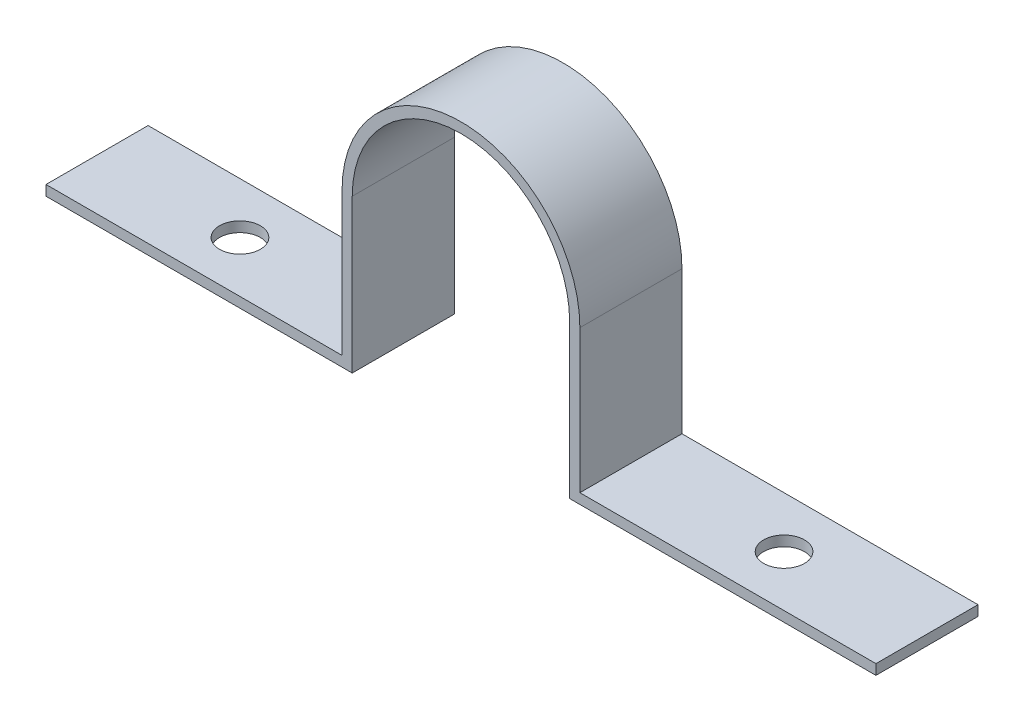
ISO-10303-21;
HEADER;
FILE_DESCRIPTION(('STEP AP214'),'2;1');
FILE_NAME('part.step','',(''),(''),'','','');
FILE_SCHEMA(('AUTOMOTIVE_DESIGN { 1 0 10303 214 1 1 1 1 }'));
ENDSEC;
DATA;
#1=APPLICATION_CONTEXT('core data for automotive mechanical design processes');
#2=APPLICATION_PROTOCOL_DEFINITION('international standard','automotive_design',2000,#1);
#3=PRODUCT_CONTEXT('',#1,'mechanical');
#4=PRODUCT('Part','Part','',(#3));
#5=PRODUCT_RELATED_PRODUCT_CATEGORY('part','',(#4));
#6=PRODUCT_DEFINITION_FORMATION('','',#4);
#7=PRODUCT_DEFINITION_CONTEXT('part definition',#1,'design');
#8=PRODUCT_DEFINITION('design','',#6,#7);
#9=PRODUCT_DEFINITION_SHAPE('','',#8);
#10=(LENGTH_UNIT() NAMED_UNIT(*) SI_UNIT(.MILLI.,.METRE.));
#11=(NAMED_UNIT(*) PLANE_ANGLE_UNIT() SI_UNIT($,.RADIAN.));
#12=(NAMED_UNIT(*) SI_UNIT($,.STERADIAN.) SOLID_ANGLE_UNIT());
#13=UNCERTAINTY_MEASURE_WITH_UNIT(LENGTH_MEASURE(1.E-05),#10,'distance_accuracy_value','');
#14=(GEOMETRIC_REPRESENTATION_CONTEXT(3) GLOBAL_UNCERTAINTY_ASSIGNED_CONTEXT((#13)) GLOBAL_UNIT_ASSIGNED_CONTEXT((#10,
#11,#12)) REPRESENTATION_CONTEXT('',''));
#15=CARTESIAN_POINT('',(0.,0.,0.));
#16=DIRECTION('',(0.,0.,1.));
#17=DIRECTION('',(1.,0.,0.));
#18=AXIS2_PLACEMENT_3D('',#15,#16,#17);
#19=CARTESIAN_POINT('',(0.,0.,10.));
#20=DIRECTION('',(0.,0.,-1.));
#21=DIRECTION('',(-1.,0.,0.));
#22=AXIS2_PLACEMENT_3D('',#19,#20,#21);
#23=CYLINDRICAL_SURFACE('',#22,10.65);
#24=CARTESIAN_POINT('',(0.,0.,0.));
#25=DIRECTION('',(0.,0.,-1.));
#26=DIRECTION('',(1.,0.,0.));
#27=AXIS2_PLACEMENT_3D('',#24,#25,#26);
#28=CIRCLE('',#27,10.65);
#29=CARTESIAN_POINT('',(-10.65,0.,0.));
#30=VERTEX_POINT('',#29);
#31=CARTESIAN_POINT('',(10.6499999999996,0.,0.));
#32=VERTEX_POINT('',#31);
#33=EDGE_CURVE('E169',#30,#32,#28,.T.);
#34=ORIENTED_EDGE('',*,*,#33,.T.);
#35=DIRECTION('',(0.,0.,-1.));
#36=VECTOR('',#35,1.);
#37=CARTESIAN_POINT('',(10.6499999999995,0.,10.));
#38=LINE('',#37,#36);
#39=CARTESIAN_POINT('',(10.6499999999995,0.,10.));
#40=VERTEX_POINT('',#39);
#41=EDGE_CURVE('E13',#40,#32,#38,.T.);
#42=ORIENTED_EDGE('',*,*,#41,.F.);
#43=CARTESIAN_POINT('',(0.,0.,10.));
#44=DIRECTION('',(0.,0.,-1.));
#45=DIRECTION('',(1.,0.,0.));
#46=AXIS2_PLACEMENT_3D('',#43,#44,#45);
#47=CIRCLE('',#46,10.65);
#48=CARTESIAN_POINT('',(-10.6500000000004,0.,10.));
#49=VERTEX_POINT('',#48);
#50=EDGE_CURVE('E194',#49,#40,#47,.T.);
#51=ORIENTED_EDGE('',*,*,#50,.F.);
#52=DIRECTION('',(0.,0.,-1.));
#53=VECTOR('',#52,1.);
#54=CARTESIAN_POINT('',(-10.6500000000004,0.,10.));
#55=LINE('',#54,#53);
#56=EDGE_CURVE('E165',#49,#30,#55,.T.);
#57=ORIENTED_EDGE('',*,*,#56,.T.);
#58=EDGE_LOOP('',(#34,#42,#51,#57));
#59=FACE_BOUND('',#58,.T.);
#60=ADVANCED_FACE('F47',(#59),#23,.F.);
#61=CARTESIAN_POINT('',(10.6499999999995,0.,10.));
#62=DIRECTION('',(1.,0.,0.));
#63=DIRECTION('',(0.,1.,0.));
#64=AXIS2_PLACEMENT_3D('',#61,#62,#63);
#65=PLANE('',#64);
#66=DIRECTION('',(0.,-1.,0.));
#67=VECTOR('',#66,1.);
#68=CARTESIAN_POINT('',(10.6499999999996,0.,0.));
#69=LINE('',#68,#67);
#70=CARTESIAN_POINT('',(10.6499999999995,-15.0000000000001,4.44089209850063E-13));
#71=VERTEX_POINT('',#70);
#72=EDGE_CURVE('E172',#32,#71,#69,.T.);
#73=ORIENTED_EDGE('',*,*,#72,.T.);
#74=DIRECTION('',(0.,0.,-1.));
#75=VECTOR('',#74,1.);
#76=CARTESIAN_POINT('',(10.6499999999995,-15.0000000000001,10.0000000000004));
#77=LINE('',#76,#75);
#78=CARTESIAN_POINT('',(10.6499999999995,-15.0000000000001,10.0000000000004));
#79=VERTEX_POINT('',#78);
#80=EDGE_CURVE('E56',#79,#71,#77,.T.);
#81=ORIENTED_EDGE('',*,*,#80,.F.);
#82=DIRECTION('',(0.,-1.,0.));
#83=VECTOR('',#82,1.);
#84=CARTESIAN_POINT('',(10.6499999999995,0.,10.));
#85=LINE('',#84,#83);
#86=EDGE_CURVE('E120',#40,#79,#85,.T.);
#87=ORIENTED_EDGE('',*,*,#86,.F.);
#88=ORIENTED_EDGE('',*,*,#41,.T.);
#89=EDGE_LOOP('',(#73,#81,#87,#88));
#90=FACE_BOUND('',#89,.T.);
#91=ADVANCED_FACE('F271',(#90),#65,.F.);
#92=CARTESIAN_POINT('',(10.6499999999995,-15.0000000000001,10.0000000000004));
#93=DIRECTION('',(0.,1.,0.));
#94=DIRECTION('',(-1.,0.,0.));
#95=AXIS2_PLACEMENT_3D('',#92,#93,#94);
#96=PLANE('',#95);
#97=CARTESIAN_POINT('',(26.65,-15.0000000000001,5.));
#98=DIRECTION('',(0.,1.,0.));
#99=DIRECTION('',(-1.,0.,0.));
#100=AXIS2_PLACEMENT_3D('',#97,#98,#99);
#101=CIRCLE('',#100,2.);
#102=CARTESIAN_POINT('',(24.6499999999999,-15.0000000000001,5.));
#103=VERTEX_POINT('',#102);
#104=EDGE_CURVE('E173',#103,#103,#101,.F.);
#105=ORIENTED_EDGE('',*,*,#104,.F.);
#106=EDGE_LOOP('',(#105));
#107=FACE_BOUND('',#106,.T.);
#108=DIRECTION('',(1.,0.,0.));
#109=VECTOR('',#108,1.);
#110=CARTESIAN_POINT('',(10.6499999999995,-15.0000000000001,4.44089209850063E-13));
#111=LINE('',#110,#109);
#112=CARTESIAN_POINT('',(40.6500000000001,-15.0000000000001,0.));
#113=VERTEX_POINT('',#112);
#114=EDGE_CURVE('E175',#71,#113,#111,.T.);
#115=ORIENTED_EDGE('',*,*,#114,.T.);
#116=DIRECTION('',(0.,0.,-1.));
#117=VECTOR('',#116,1.);
#118=CARTESIAN_POINT('',(40.65,-15.0000000000001,10.));
#119=LINE('',#118,#117);
#120=CARTESIAN_POINT('',(40.65,-15.0000000000001,10.));
#121=VERTEX_POINT('',#120);
#122=EDGE_CURVE('E213',#121,#113,#119,.T.);
#123=ORIENTED_EDGE('',*,*,#122,.F.);
#124=DIRECTION('',(1.,0.,0.));
#125=VECTOR('',#124,1.);
#126=CARTESIAN_POINT('',(10.6499999999995,-15.0000000000001,10.0000000000004));
#127=LINE('',#126,#125);
#128=EDGE_CURVE('E232',#79,#121,#127,.T.);
#129=ORIENTED_EDGE('',*,*,#128,.F.);
#130=ORIENTED_EDGE('',*,*,#80,.T.);
#131=EDGE_LOOP('',(#115,#123,#129,#130));
#132=FACE_BOUND('',#131,.T.);
#133=ADVANCED_FACE('F275',(#107,#132),#96,.F.);
#134=CARTESIAN_POINT('',(40.65,-15.0000000000001,10.));
#135=DIRECTION('',(-1.,0.,0.));
#136=DIRECTION('',(0.,0.,1.));
#137=AXIS2_PLACEMENT_3D('',#134,#135,#136);
#138=PLANE('',#137);
#139=DIRECTION('',(0.,1.,0.));
#140=VECTOR('',#139,1.);
#141=CARTESIAN_POINT('',(40.6500000000001,-15.0000000000001,0.));
#142=LINE('',#141,#140);
#143=CARTESIAN_POINT('',(40.65,-14.,0.));
#144=VERTEX_POINT('',#143);
#145=EDGE_CURVE('E177',#113,#144,#142,.T.);
#146=ORIENTED_EDGE('',*,*,#145,.T.);
#147=DIRECTION('',(0.,0.,-1.));
#148=VECTOR('',#147,1.);
#149=CARTESIAN_POINT('',(40.65,-14.,10.));
#150=LINE('',#149,#148);
#151=CARTESIAN_POINT('',(40.65,-14.,10.));
#152=VERTEX_POINT('',#151);
#153=EDGE_CURVE('E210',#152,#144,#150,.T.);
#154=ORIENTED_EDGE('',*,*,#153,.F.);
#155=DIRECTION('',(0.,1.,0.));
#156=VECTOR('',#155,1.);
#157=CARTESIAN_POINT('',(40.65,-15.0000000000001,10.));
#158=LINE('',#157,#156);
#159=EDGE_CURVE('E234',#121,#152,#158,.T.);
#160=ORIENTED_EDGE('',*,*,#159,.F.);
#161=ORIENTED_EDGE('',*,*,#122,.T.);
#162=EDGE_LOOP('',(#146,#154,#160,#161));
#163=FACE_BOUND('',#162,.T.);
#164=ADVANCED_FACE('F279',(#163),#138,.F.);
#165=CARTESIAN_POINT('',(11.6499999999999,-14.0000000000001,10.0000000000004));
#166=DIRECTION('',(0.,-1.,0.));
#167=DIRECTION('',(1.,0.,0.));
#168=AXIS2_PLACEMENT_3D('',#165,#166,#167);
#169=PLANE('',#168);
#170=CARTESIAN_POINT('',(26.65,-14.,5.));
#171=DIRECTION('',(0.,-1.,0.));
#172=DIRECTION('',(1.,0.,0.));
#173=AXIS2_PLACEMENT_3D('',#170,#171,#172);
#174=CIRCLE('',#173,2.);
#175=CARTESIAN_POINT('',(28.65,-14.,5.));
#176=VERTEX_POINT('',#175);
#177=EDGE_CURVE('E50',#176,#176,#174,.F.);
#178=ORIENTED_EDGE('',*,*,#177,.F.);
#179=EDGE_LOOP('',(#178));
#180=FACE_BOUND('',#179,.T.);
#181=DIRECTION('',(-1.,0.,0.));
#182=VECTOR('',#181,1.);
#183=CARTESIAN_POINT('',(11.65,-14.0000000000001,4.44089209850063E-13));
#184=LINE('',#183,#182);
#185=CARTESIAN_POINT('',(11.65,-14.0000000000001,4.44089209850063E-13));
#186=VERTEX_POINT('',#185);
#187=EDGE_CURVE('E180',#144,#186,#184,.T.);
#188=ORIENTED_EDGE('',*,*,#187,.T.);
#189=DIRECTION('',(0.,0.,-1.));
#190=VECTOR('',#189,1.);
#191=CARTESIAN_POINT('',(11.6499999999999,-14.0000000000001,10.0000000000004));
#192=LINE('',#191,#190);
#193=CARTESIAN_POINT('',(11.6499999999999,-14.0000000000001,10.0000000000004));
#194=VERTEX_POINT('',#193);
#195=EDGE_CURVE('E207',#194,#186,#192,.T.);
#196=ORIENTED_EDGE('',*,*,#195,.F.);
#197=DIRECTION('',(-1.,0.,0.));
#198=VECTOR('',#197,1.);
#199=CARTESIAN_POINT('',(39.65,-14.,10.));
#200=LINE('',#199,#198);
#201=EDGE_CURVE('E236',#152,#194,#200,.T.);
#202=ORIENTED_EDGE('',*,*,#201,.F.);
#203=ORIENTED_EDGE('',*,*,#153,.T.);
#204=EDGE_LOOP('',(#188,#196,#202,#203));
#205=FACE_BOUND('',#204,.T.);
#206=ADVANCED_FACE('F285',(#180,#205),#169,.F.);
#207=CARTESIAN_POINT('',(11.6499999999996,0.,10.));
#208=DIRECTION('',(-1.,0.,0.));
#209=DIRECTION('',(0.,0.,1.));
#210=AXIS2_PLACEMENT_3D('',#207,#208,#209);
#211=PLANE('',#210);
#212=DIRECTION('',(0.,1.,0.));
#213=VECTOR('',#212,1.);
#214=CARTESIAN_POINT('',(11.65,0.,0.));
#215=LINE('',#214,#213);
#216=CARTESIAN_POINT('',(11.65,0.,0.));
#217=VERTEX_POINT('',#216);
#218=EDGE_CURVE('E182',#186,#217,#215,.T.);
#219=ORIENTED_EDGE('',*,*,#218,.T.);
#220=DIRECTION('',(0.,0.,-1.));
#221=VECTOR('',#220,1.);
#222=CARTESIAN_POINT('',(11.6499999999996,0.,10.));
#223=LINE('',#222,#221);
#224=CARTESIAN_POINT('',(11.6499999999996,0.,10.));
#225=VERTEX_POINT('',#224);
#226=EDGE_CURVE('E204',#225,#217,#223,.T.);
#227=ORIENTED_EDGE('',*,*,#226,.F.);
#228=DIRECTION('',(0.,1.,0.));
#229=VECTOR('',#228,1.);
#230=CARTESIAN_POINT('',(11.6499999999996,0.,10.));
#231=LINE('',#230,#229);
#232=EDGE_CURVE('E238',#194,#225,#231,.T.);
#233=ORIENTED_EDGE('',*,*,#232,.F.);
#234=ORIENTED_EDGE('',*,*,#195,.T.);
#235=EDGE_LOOP('',(#219,#227,#233,#234));
#236=FACE_BOUND('',#235,.T.);
#237=ADVANCED_FACE('F289',(#236),#211,.F.);
#238=CARTESIAN_POINT('',(0.,0.,10.));
#239=DIRECTION('',(0.,0.,-1.));
#240=DIRECTION('',(-1.,0.,0.));
#241=AXIS2_PLACEMENT_3D('',#238,#239,#240);
#242=CYLINDRICAL_SURFACE('',#241,11.65);
#243=CARTESIAN_POINT('',(0.,0.,0.));
#244=DIRECTION('',(0.,0.,1.));
#245=DIRECTION('',(1.,0.,0.));
#246=AXIS2_PLACEMENT_3D('',#243,#244,#245);
#247=CIRCLE('',#246,11.65);
#248=CARTESIAN_POINT('',(-11.6500000000004,0.,0.));
#249=VERTEX_POINT('',#248);
#250=EDGE_CURVE('E184',#217,#249,#247,.T.);
#251=ORIENTED_EDGE('',*,*,#250,.T.);
#252=DIRECTION('',(0.,0.,-1.));
#253=VECTOR('',#252,1.);
#254=CARTESIAN_POINT('',(-11.6500000000004,0.,10.));
#255=LINE('',#254,#253);
#256=CARTESIAN_POINT('',(-11.6500000000004,0.,10.));
#257=VERTEX_POINT('',#256);
#258=EDGE_CURVE('E201',#257,#249,#255,.T.);
#259=ORIENTED_EDGE('',*,*,#258,.F.);
#260=CARTESIAN_POINT('',(0.,0.,10.));
#261=DIRECTION('',(0.,0.,1.));
#262=DIRECTION('',(1.,0.,0.));
#263=AXIS2_PLACEMENT_3D('',#260,#261,#262);
#264=CIRCLE('',#263,11.65);
#265=EDGE_CURVE('E240',#225,#257,#264,.T.);
#266=ORIENTED_EDGE('',*,*,#265,.F.);
#267=ORIENTED_EDGE('',*,*,#226,.T.);
#268=EDGE_LOOP('',(#251,#259,#266,#267));
#269=FACE_BOUND('',#268,.T.);
#270=ADVANCED_FACE('F293',(#269),#242,.T.);
#271=CARTESIAN_POINT('',(-11.6500000000004,0.,10.));
#272=DIRECTION('',(1.,0.,0.));
#273=DIRECTION('',(0.,0.,-1.));
#274=AXIS2_PLACEMENT_3D('',#271,#272,#273);
#275=PLANE('',#274);
#276=DIRECTION('',(0.,-1.,0.));
#277=VECTOR('',#276,1.);
#278=CARTESIAN_POINT('',(-11.6500000000004,0.,0.));
#279=LINE('',#278,#277);
#280=CARTESIAN_POINT('',(-11.6500000000004,-14.0000000000001,0.));
#281=VERTEX_POINT('',#280);
#282=EDGE_CURVE('E186',#249,#281,#279,.T.);
#283=ORIENTED_EDGE('',*,*,#282,.T.);
#284=DIRECTION('',(0.,0.,-1.));
#285=VECTOR('',#284,1.);
#286=CARTESIAN_POINT('',(-11.6500000000004,-14.0000000000001,10.));
#287=LINE('',#286,#285);
#288=CARTESIAN_POINT('',(-11.6500000000004,-14.0000000000001,10.));
#289=VERTEX_POINT('',#288);
#290=EDGE_CURVE('E198',#289,#281,#287,.T.);
#291=ORIENTED_EDGE('',*,*,#290,.F.);
#292=DIRECTION('',(0.,-1.,0.));
#293=VECTOR('',#292,1.);
#294=CARTESIAN_POINT('',(-11.6500000000004,0.,10.));
#295=LINE('',#294,#293);
#296=EDGE_CURVE('E242',#257,#289,#295,.T.);
#297=ORIENTED_EDGE('',*,*,#296,.F.);
#298=ORIENTED_EDGE('',*,*,#258,.T.);
#299=EDGE_LOOP('',(#283,#291,#297,#298));
#300=FACE_BOUND('',#299,.T.);
#301=ADVANCED_FACE('F248',(#300),#275,.F.);
#302=CARTESIAN_POINT('',(-39.6500000000004,-14.,10.));
#303=DIRECTION('',(0.,-1.,0.));
#304=DIRECTION('',(0.,0.,-1.));
#305=AXIS2_PLACEMENT_3D('',#302,#303,#304);
#306=PLANE('',#305);
#307=CARTESIAN_POINT('',(-26.6500000000004,-14.,5.));
#308=DIRECTION('',(0.,-1.,0.));
#309=DIRECTION('',(0.,0.,-1.));
#310=AXIS2_PLACEMENT_3D('',#307,#308,#309);
#311=CIRCLE('',#310,2.);
#312=CARTESIAN_POINT('',(-26.6500000000004,-14.,3.));
#313=VERTEX_POINT('',#312);
#314=EDGE_CURVE('E219',#313,#313,#311,.F.);
#315=ORIENTED_EDGE('',*,*,#314,.F.);
#316=EDGE_LOOP('',(#315));
#317=FACE_BOUND('',#316,.T.);
#318=DIRECTION('',(-1.,0.,0.));
#319=VECTOR('',#318,1.);
#320=CARTESIAN_POINT('',(-39.6500000000001,-14.,0.));
#321=LINE('',#320,#319);
#322=CARTESIAN_POINT('',(-40.6500000000004,-14.,0.));
#323=VERTEX_POINT('',#322);
#324=EDGE_CURVE('E189',#281,#323,#321,.T.);
#325=ORIENTED_EDGE('',*,*,#324,.T.);
#326=DIRECTION('',(0.,0.,-1.));
#327=VECTOR('',#326,1.);
#328=CARTESIAN_POINT('',(-40.6500000000004,-14.,10.));
#329=LINE('',#328,#327);
#330=CARTESIAN_POINT('',(-40.6500000000004,-14.,10.));
#331=VERTEX_POINT('',#330);
#332=EDGE_CURVE('E160',#331,#323,#329,.T.);
#333=ORIENTED_EDGE('',*,*,#332,.F.);
#334=DIRECTION('',(-1.00000000000001,0.,0.));
#335=VECTOR('',#334,1.);
#336=CARTESIAN_POINT('',(-11.6500000000004,-14.0000000000001,10.));
#337=LINE('',#336,#335);
#338=EDGE_CURVE('E151',#289,#331,#337,.T.);
#339=ORIENTED_EDGE('',*,*,#338,.F.);
#340=ORIENTED_EDGE('',*,*,#290,.T.);
#341=EDGE_LOOP('',(#325,#333,#339,#340));
#342=FACE_BOUND('',#341,.T.);
#343=ADVANCED_FACE('F251',(#317,#342),#306,.F.);
#344=CARTESIAN_POINT('',(-40.6500000000005,-15.0000000000001,10.));
#345=DIRECTION('',(1.,0.,0.));
#346=DIRECTION('',(0.,0.,-1.));
#347=AXIS2_PLACEMENT_3D('',#344,#345,#346);
#348=PLANE('',#347);
#349=DIRECTION('',(0.,-1.,0.));
#350=VECTOR('',#349,1.);
#351=CARTESIAN_POINT('',(-40.6500000000004,-15.0000000000001,0.));
#352=LINE('',#351,#350);
#353=CARTESIAN_POINT('',(-40.6500000000004,-15.0000000000001,0.));
#354=VERTEX_POINT('',#353);
#355=EDGE_CURVE('E159',#323,#354,#352,.T.);
#356=ORIENTED_EDGE('',*,*,#355,.T.);
#357=DIRECTION('',(0.,0.,-1.));
#358=VECTOR('',#357,1.);
#359=CARTESIAN_POINT('',(-40.6500000000005,-15.0000000000001,10.));
#360=LINE('',#359,#358);
#361=CARTESIAN_POINT('',(-40.6500000000005,-15.0000000000001,10.));
#362=VERTEX_POINT('',#361);
#363=EDGE_CURVE('E156',#362,#354,#360,.T.);
#364=ORIENTED_EDGE('',*,*,#363,.F.);
#365=DIRECTION('',(0.,-1.,0.));
#366=VECTOR('',#365,1.);
#367=CARTESIAN_POINT('',(-40.6500000000005,-15.0000000000001,10.));
#368=LINE('',#367,#366);
#369=EDGE_CURVE('E145',#331,#362,#368,.T.);
#370=ORIENTED_EDGE('',*,*,#369,.F.);
#371=ORIENTED_EDGE('',*,*,#332,.T.);
#372=EDGE_LOOP('',(#356,#364,#370,#371));
#373=FACE_BOUND('',#372,.T.);
#374=ADVANCED_FACE('F157',(#373),#348,.F.);
#375=CARTESIAN_POINT('',(-10.6500000000004,-15.0000000000001,10.));
#376=DIRECTION('',(0.,1.00000000000001,0.));
#377=DIRECTION('',(-1.00000000000001,0.,0.));
#378=AXIS2_PLACEMENT_3D('',#375,#376,#377);
#379=PLANE('',#378);
#380=CARTESIAN_POINT('',(-26.6500000000004,-15.0000000000001,5.));
#381=DIRECTION('',(0.,1.00000000000001,0.));
#382=DIRECTION('',(-1.00000000000001,0.,0.));
#383=AXIS2_PLACEMENT_3D('',#380,#381,#382);
#384=CIRCLE('',#383,2.);
#385=CARTESIAN_POINT('',(-28.6500000000005,-15.0000000000001,5.));
#386=VERTEX_POINT('',#385);
#387=EDGE_CURVE('E217',#386,#386,#384,.F.);
#388=ORIENTED_EDGE('',*,*,#387,.F.);
#389=EDGE_LOOP('',(#388));
#390=FACE_BOUND('',#389,.T.);
#391=DIRECTION('',(1.00000000000001,0.,0.));
#392=VECTOR('',#391,1.);
#393=CARTESIAN_POINT('',(-10.6500000000004,-15.0000000000001,0.));
#394=LINE('',#393,#392);
#395=CARTESIAN_POINT('',(-10.6500000000004,-15.0000000000001,0.));
#396=VERTEX_POINT('',#395);
#397=EDGE_CURVE('E106',#354,#396,#394,.T.);
#398=ORIENTED_EDGE('',*,*,#397,.T.);
#399=DIRECTION('',(0.,0.,-1.));
#400=VECTOR('',#399,1.);
#401=CARTESIAN_POINT('',(-10.6500000000004,-15.0000000000001,10.));
#402=LINE('',#401,#400);
#403=CARTESIAN_POINT('',(-10.6500000000004,-15.0000000000001,10.));
#404=VERTEX_POINT('',#403);
#405=EDGE_CURVE('E161',#404,#396,#402,.T.);
#406=ORIENTED_EDGE('',*,*,#405,.F.);
#407=DIRECTION('',(1.00000000000001,0.,0.));
#408=VECTOR('',#407,1.);
#409=CARTESIAN_POINT('',(-10.6500000000004,-15.0000000000001,10.));
#410=LINE('',#409,#408);
#411=EDGE_CURVE('E149',#362,#404,#410,.T.);
#412=ORIENTED_EDGE('',*,*,#411,.F.);
#413=ORIENTED_EDGE('',*,*,#363,.T.);
#414=EDGE_LOOP('',(#398,#406,#412,#413));
#415=FACE_BOUND('',#414,.T.);
#416=ADVANCED_FACE('F163',(#390,#415),#379,.F.);
#417=CARTESIAN_POINT('',(-10.6500000000004,0.,10.));
#418=DIRECTION('',(-1.00000000000001,0.,0.));
#419=DIRECTION('',(0.,-1.00000000000001,0.));
#420=AXIS2_PLACEMENT_3D('',#417,#418,#419);
#421=PLANE('',#420);
#422=DIRECTION('',(0.,1.00000000000001,0.));
#423=VECTOR('',#422,1.);
#424=CARTESIAN_POINT('',(-10.65,0.,0.));
#425=LINE('',#424,#423);
#426=EDGE_CURVE('E112',#396,#30,#425,.T.);
#427=ORIENTED_EDGE('',*,*,#426,.T.);
#428=ORIENTED_EDGE('',*,*,#56,.F.);
#429=DIRECTION('',(0.,1.00000000000001,0.));
#430=VECTOR('',#429,1.);
#431=CARTESIAN_POINT('',(-10.6500000000004,0.,10.));
#432=LINE('',#431,#430);
#433=EDGE_CURVE('E65',#404,#49,#432,.T.);
#434=ORIENTED_EDGE('',*,*,#433,.F.);
#435=ORIENTED_EDGE('',*,*,#405,.T.);
#436=EDGE_LOOP('',(#427,#428,#434,#435));
#437=FACE_BOUND('',#436,.T.);
#438=ADVANCED_FACE('F259',(#437),#421,.F.);
#439=CARTESIAN_POINT('',(0.,0.,10.));
#440=DIRECTION('',(0.,0.,1.));
#441=DIRECTION('',(1.,0.,0.));
#442=AXIS2_PLACEMENT_3D('',#439,#440,#441);
#443=PLANE('',#442);
#444=ORIENTED_EDGE('',*,*,#50,.T.);
#445=ORIENTED_EDGE('',*,*,#86,.T.);
#446=ORIENTED_EDGE('',*,*,#128,.T.);
#447=ORIENTED_EDGE('',*,*,#159,.T.);
#448=ORIENTED_EDGE('',*,*,#201,.T.);
#449=ORIENTED_EDGE('',*,*,#232,.T.);
#450=ORIENTED_EDGE('',*,*,#265,.T.);
#451=ORIENTED_EDGE('',*,*,#296,.T.);
#452=ORIENTED_EDGE('',*,*,#338,.T.);
#453=ORIENTED_EDGE('',*,*,#369,.T.);
#454=ORIENTED_EDGE('',*,*,#411,.T.);
#455=ORIENTED_EDGE('',*,*,#433,.T.);
#456=EDGE_LOOP('',(#444,#445,#446,#447,#448,#449,#450,#451,#452,#453,#454,#455));
#457=FACE_BOUND('',#456,.T.);
#458=ADVANCED_FACE('F147',(#457),#443,.T.);
#459=CARTESIAN_POINT('',(0.,0.,0.));
#460=DIRECTION('',(0.,0.,1.));
#461=DIRECTION('',(1.,0.,0.));
#462=AXIS2_PLACEMENT_3D('',#459,#460,#461);
#463=PLANE('',#462);
#464=ORIENTED_EDGE('',*,*,#33,.F.);
#465=ORIENTED_EDGE('',*,*,#426,.F.);
#466=ORIENTED_EDGE('',*,*,#397,.F.);
#467=ORIENTED_EDGE('',*,*,#355,.F.);
#468=ORIENTED_EDGE('',*,*,#324,.F.);
#469=ORIENTED_EDGE('',*,*,#282,.F.);
#470=ORIENTED_EDGE('',*,*,#250,.F.);
#471=ORIENTED_EDGE('',*,*,#218,.F.);
#472=ORIENTED_EDGE('',*,*,#187,.F.);
#473=ORIENTED_EDGE('',*,*,#145,.F.);
#474=ORIENTED_EDGE('',*,*,#114,.F.);
#475=ORIENTED_EDGE('',*,*,#72,.F.);
#476=EDGE_LOOP('',(#464,#465,#466,#467,#468,#469,#470,#471,#472,#473,#474,#475));
#477=FACE_BOUND('',#476,.T.);
#478=ADVANCED_FACE('F254',(#477),#463,.F.);
#479=CARTESIAN_POINT('',(-26.6500000000004,-6.50735135169497,5.00000000000045));
#480=DIRECTION('',(0.,-1.,0.));
#481=DIRECTION('',(0.,0.,-1.));
#482=AXIS2_PLACEMENT_3D('',#479,#480,#481);
#483=CYLINDRICAL_SURFACE('',#482,2.);
#484=ORIENTED_EDGE('',*,*,#387,.T.);
#485=EDGE_LOOP('',(#484));
#486=FACE_BOUND('',#485,.T.);
#487=ORIENTED_EDGE('',*,*,#314,.T.);
#488=EDGE_LOOP('',(#487));
#489=FACE_BOUND('',#488,.T.);
#490=ADVANCED_FACE('F331',(#486,#489),#483,.F.);
#491=CARTESIAN_POINT('',(26.65,-6.50735135169497,5.00000000000045));
#492=DIRECTION('',(0.,-1.,0.));
#493=DIRECTION('',(0.,0.,-1.));
#494=AXIS2_PLACEMENT_3D('',#491,#492,#493);
#495=CYLINDRICAL_SURFACE('',#494,2.);
#496=ORIENTED_EDGE('',*,*,#177,.T.);
#497=EDGE_LOOP('',(#496));
#498=FACE_BOUND('',#497,.T.);
#499=ORIENTED_EDGE('',*,*,#104,.T.);
#500=EDGE_LOOP('',(#499));
#501=FACE_BOUND('',#500,.T.);
#502=ADVANCED_FACE('F339',(#498,#501),#495,.F.);
#503=CLOSED_SHELL('',(#60,#91,#133,#164,#206,#237,#270,#301,#343,#374,#416,#438,#458,#478,#490,#502));
#504=MANIFOLD_SOLID_BREP('B2',#503);
#505=ADVANCED_BREP_SHAPE_REPRESENTATION('',(#18,#504),#14);
#506=SHAPE_DEFINITION_REPRESENTATION(#9,#505);
ENDSEC;
END-ISO-10303-21;
